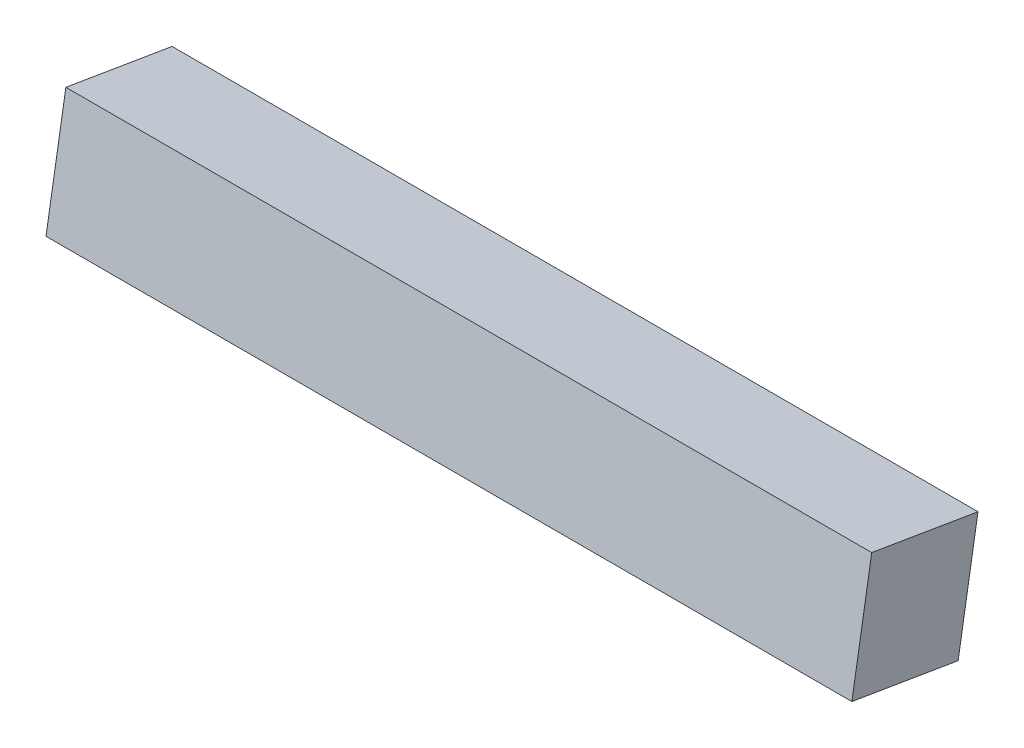
ISO-10303-21;
HEADER;
FILE_DESCRIPTION(('STEP AP214'),'2;1');
FILE_NAME('part.step','',(''),(''),'','','');
FILE_SCHEMA(('AUTOMOTIVE_DESIGN { 1 0 10303 214 1 1 1 1 }'));
ENDSEC;
DATA;
#1=APPLICATION_CONTEXT('core data for automotive mechanical design processes');
#2=APPLICATION_PROTOCOL_DEFINITION('international standard','automotive_design',2000,#1);
#3=PRODUCT_CONTEXT('',#1,'mechanical');
#4=PRODUCT('Part','Part','',(#3));
#5=PRODUCT_RELATED_PRODUCT_CATEGORY('part','',(#4));
#6=PRODUCT_DEFINITION_FORMATION('','',#4);
#7=PRODUCT_DEFINITION_CONTEXT('part definition',#1,'design');
#8=PRODUCT_DEFINITION('design','',#6,#7);
#9=PRODUCT_DEFINITION_SHAPE('','',#8);
#10=(LENGTH_UNIT() NAMED_UNIT(*) SI_UNIT(.MILLI.,.METRE.));
#11=(NAMED_UNIT(*) PLANE_ANGLE_UNIT() SI_UNIT($,.RADIAN.));
#12=(NAMED_UNIT(*) SI_UNIT($,.STERADIAN.) SOLID_ANGLE_UNIT());
#13=UNCERTAINTY_MEASURE_WITH_UNIT(LENGTH_MEASURE(1.E-05),#10,'distance_accuracy_value','');
#14=(GEOMETRIC_REPRESENTATION_CONTEXT(3) GLOBAL_UNCERTAINTY_ASSIGNED_CONTEXT((#13)) GLOBAL_UNIT_ASSIGNED_CONTEXT((#10,
#11,#12)) REPRESENTATION_CONTEXT('',''));
#15=CARTESIAN_POINT('',(0.,0.,0.));
#16=DIRECTION('',(0.,0.,1.));
#17=DIRECTION('',(1.,0.,0.));
#18=AXIS2_PLACEMENT_3D('',#15,#16,#17);
#19=CARTESIAN_POINT('',(1343.2192393736,1117.50372367477,1248.12409398602));
#20=DIRECTION('',(0.,0.986393923832144,-0.164398987305355));
#21=DIRECTION('',(0.,0.164398987305355,0.986393923832144));
#22=AXIS2_PLACEMENT_3D('',#19,#20,#21);
#23=PLANE('',#22);
#24=CARTESIAN_POINT('',(1343.2192393736,1116.68172873824,1243.19212436686));
#25=CARTESIAN_POINT('',(1355.68754660701,1116.68172873824,1243.19212436686));
#26=CARTESIAN_POINT('',(1368.15585384041,1116.68172873824,1243.19212436686));
#27=CARTESIAN_POINT('',(1380.62416107382,1116.68172873824,1243.19212436686));
#28=B_SPLINE_CURVE_WITH_KNOTS('',3,(#24,#25,#26,#27),.UNSPECIFIED.,.F.,.F.,(4,4),(0.,
0.434850380748231),.UNSPECIFIED.);
#29=CARTESIAN_POINT('',(1343.2192393736,1116.68172873824,1243.19212436686));
#30=VERTEX_POINT('',#29);
#31=CARTESIAN_POINT('',(1380.62416107382,1116.68172873824,1243.19212436686));
#32=VERTEX_POINT('',#31);
#33=EDGE_CURVE('E66',#30,#32,#28,.T.);
#34=ORIENTED_EDGE('',*,*,#33,.T.);
#35=DIRECTION('',(0.,-0.164398987305355,-0.986393923832144));
#36=VECTOR('',#35,1.);
#37=CARTESIAN_POINT('',(1380.62416107382,1117.50372367477,1248.12409398602));
#38=LINE('',#37,#36);
#39=CARTESIAN_POINT('',(1380.62416107382,1117.50372367477,1248.12409398602));
#40=VERTEX_POINT('',#39);
#41=EDGE_CURVE('E74',#40,#32,#38,.T.);
#42=ORIENTED_EDGE('',*,*,#41,.F.);
#43=CARTESIAN_POINT('',(1343.2192393736,1117.50372367477,1248.12409398602));
#44=CARTESIAN_POINT('',(1355.68754660701,1117.50372367477,1248.12409398602));
#45=CARTESIAN_POINT('',(1368.15585384041,1117.50372367477,1248.12409398602));
#46=CARTESIAN_POINT('',(1380.62416107382,1117.50372367477,1248.12409398602));
#47=B_SPLINE_CURVE_WITH_KNOTS('',3,(#43,#44,#45,#46),.UNSPECIFIED.,.F.,.F.,(4,4),(0.,
0.434850380748231),.UNSPECIFIED.);
#48=CARTESIAN_POINT('',(1343.2192393736,1117.50372367477,1248.12409398602));
#49=VERTEX_POINT('',#48);
#50=EDGE_CURVE('E79',#49,#40,#47,.T.);
#51=ORIENTED_EDGE('',*,*,#50,.F.);
#52=DIRECTION('',(0.,-0.164398987305355,-0.986393923832144));
#53=VECTOR('',#52,1.);
#54=CARTESIAN_POINT('',(1343.2192393736,1117.50372367477,1248.12409398602));
#55=LINE('',#54,#53);
#56=EDGE_CURVE('E71',#49,#30,#55,.T.);
#57=ORIENTED_EDGE('',*,*,#56,.T.);
#58=EDGE_LOOP('',(#34,#42,#51,#57));
#59=FACE_BOUND('',#58,.T.);
#60=ADVANCED_FACE('F17',(#59),#23,.F.);
#61=CARTESIAN_POINT('',(1380.62416107382,1117.50372367477,1248.12409398602));
#62=DIRECTION('',(-1.,0.,0.));
#63=DIRECTION('',(0.,0.,1.));
#64=AXIS2_PLACEMENT_3D('',#61,#62,#63);
#65=PLANE('',#64);
#66=CARTESIAN_POINT('',(1380.62416107382,1116.68172873824,1243.19212436686));
#67=CARTESIAN_POINT('',(1380.62416107382,1118.52432383384,1242.88502518426));
#68=CARTESIAN_POINT('',(1380.62416107382,1120.36691892945,1242.57792600166));
#69=CARTESIAN_POINT('',(1380.62416107382,1122.20951402505,1242.27082681906));
#70=B_SPLINE_CURVE_WITH_KNOTS('',3,(#66,#67,#68,#69),.UNSPECIFIED.,.F.,.F.,(4,4),
(0.434850380748231,0.5),.UNSPECIFIED.);
#71=CARTESIAN_POINT('',(1380.62416107382,1122.20951402505,1242.27082681906));
#72=VERTEX_POINT('',#71);
#73=EDGE_CURVE('E63',#32,#72,#70,.T.);
#74=ORIENTED_EDGE('',*,*,#73,.T.);
#75=DIRECTION('',(0.,-0.164398987305355,-0.986393923832144));
#76=VECTOR('',#75,1.);
#77=CARTESIAN_POINT('',(1380.62416107382,1123.03150896158,1247.20279643822));
#78=LINE('',#77,#76);
#79=CARTESIAN_POINT('',(1380.62416107382,1123.03150896158,1247.20279643822));
#80=VERTEX_POINT('',#79);
#81=EDGE_CURVE('E70',#80,#72,#78,.T.);
#82=ORIENTED_EDGE('',*,*,#81,.F.);
#83=CARTESIAN_POINT('',(1380.62416107382,1117.50372367477,1248.12409398602));
#84=CARTESIAN_POINT('',(1380.62416107382,1119.34631877037,1247.81699480342));
#85=CARTESIAN_POINT('',(1380.62416107382,1121.18891386597,1247.50989562082));
#86=CARTESIAN_POINT('',(1380.62416107382,1123.03150896158,1247.20279643822));
#87=B_SPLINE_CURVE_WITH_KNOTS('',3,(#83,#84,#85,#86),.UNSPECIFIED.,.F.,.F.,(4,4),
(0.434850380748231,0.5),.UNSPECIFIED.);
#88=EDGE_CURVE('E57',#40,#80,#87,.T.);
#89=ORIENTED_EDGE('',*,*,#88,.F.);
#90=ORIENTED_EDGE('',*,*,#41,.T.);
#91=EDGE_LOOP('',(#74,#82,#89,#90));
#92=FACE_BOUND('',#91,.T.);
#93=ADVANCED_FACE('F75',(#92),#65,.F.);
#94=CARTESIAN_POINT('',(1380.62416107382,1123.03150896158,1247.20279643822));
#95=DIRECTION('',(0.,-0.986393923832144,0.164398987305355));
#96=DIRECTION('',(0.,-0.164398987305355,-0.986393923832144));
#97=AXIS2_PLACEMENT_3D('',#94,#95,#96);
#98=PLANE('',#97);
#99=CARTESIAN_POINT('',(1380.62416107382,1122.20951402505,1242.27082681906));
#100=CARTESIAN_POINT('',(1368.15585384041,1122.20951402505,1242.27082681906));
#101=CARTESIAN_POINT('',(1355.68754660701,1122.20951402505,1242.27082681906));
#102=CARTESIAN_POINT('',(1343.2192393736,1122.20951402505,1242.27082681906));
#103=B_SPLINE_CURVE_WITH_KNOTS('',3,(#99,#100,#101,#102),.UNSPECIFIED.,.F.,.F.,(4,4),(0.5,
0.934850380748232),.UNSPECIFIED.);
#104=CARTESIAN_POINT('',(1343.2192393736,1122.20951402505,1242.27082681906));
#105=VERTEX_POINT('',#104);
#106=EDGE_CURVE('E67',#72,#105,#103,.T.);
#107=ORIENTED_EDGE('',*,*,#106,.T.);
#108=DIRECTION('',(0.,-0.164398987305355,-0.986393923832144));
#109=VECTOR('',#108,1.);
#110=CARTESIAN_POINT('',(1343.2192393736,1123.03150896158,1247.20279643822));
#111=LINE('',#110,#109);
#112=CARTESIAN_POINT('',(1343.2192393736,1123.03150896158,1247.20279643822));
#113=VERTEX_POINT('',#112);
#114=EDGE_CURVE('E126',#113,#105,#111,.T.);
#115=ORIENTED_EDGE('',*,*,#114,.F.);
#116=CARTESIAN_POINT('',(1380.62416107382,1123.03150896158,1247.20279643822));
#117=CARTESIAN_POINT('',(1368.15585384041,1123.03150896158,1247.20279643822));
#118=CARTESIAN_POINT('',(1355.68754660701,1123.03150896158,1247.20279643822));
#119=CARTESIAN_POINT('',(1343.2192393736,1123.03150896158,1247.20279643822));
#120=B_SPLINE_CURVE_WITH_KNOTS('',3,(#116,#117,#118,#119),.UNSPECIFIED.,.F.,.F.,(4,4),(0.5,
0.934850380748232),.UNSPECIFIED.);
#121=EDGE_CURVE('E38',#80,#113,#120,.T.);
#122=ORIENTED_EDGE('',*,*,#121,.F.);
#123=ORIENTED_EDGE('',*,*,#81,.T.);
#124=EDGE_LOOP('',(#107,#115,#122,#123));
#125=FACE_BOUND('',#124,.T.);
#126=ADVANCED_FACE('F160',(#125),#98,.F.);
#127=CARTESIAN_POINT('',(1343.2192393736,1123.03150896158,1247.20279643822));
#128=DIRECTION('',(1.,0.,0.));
#129=DIRECTION('',(0.,0.,-1.));
#130=AXIS2_PLACEMENT_3D('',#127,#128,#129);
#131=PLANE('',#130);
#132=CARTESIAN_POINT('',(1343.2192393736,1122.20951402505,1242.27082681906));
#133=CARTESIAN_POINT('',(1343.2192393736,1120.36691892945,1242.57792600166));
#134=CARTESIAN_POINT('',(1343.2192393736,1118.52432383384,1242.88502518426));
#135=CARTESIAN_POINT('',(1343.2192393736,1116.68172873824,1243.19212436686));
#136=B_SPLINE_CURVE_WITH_KNOTS('',3,(#132,#133,#134,#135),.UNSPECIFIED.,.F.,.F.,(4,4),
(0.934850380748232,1.),.UNSPECIFIED.);
#137=EDGE_CURVE('E30',#105,#30,#136,.T.);
#138=ORIENTED_EDGE('',*,*,#137,.T.);
#139=ORIENTED_EDGE('',*,*,#56,.F.);
#140=CARTESIAN_POINT('',(1343.2192393736,1123.03150896158,1247.20279643822));
#141=CARTESIAN_POINT('',(1343.2192393736,1121.18891386597,1247.50989562082));
#142=CARTESIAN_POINT('',(1343.2192393736,1119.34631877037,1247.81699480342));
#143=CARTESIAN_POINT('',(1343.2192393736,1117.50372367477,1248.12409398602));
#144=B_SPLINE_CURVE_WITH_KNOTS('',3,(#140,#141,#142,#143),.UNSPECIFIED.,.F.,.F.,(4,4),
(0.934850380748232,1.),.UNSPECIFIED.);
#145=EDGE_CURVE('E11',#113,#49,#144,.T.);
#146=ORIENTED_EDGE('',*,*,#145,.F.);
#147=ORIENTED_EDGE('',*,*,#114,.T.);
#148=EDGE_LOOP('',(#138,#139,#146,#147));
#149=FACE_BOUND('',#148,.T.);
#150=ADVANCED_FACE('F157',(#149),#131,.F.);
#151=CARTESIAN_POINT('',(1361.92170022371,1117.50372367477,1248.12409398602));
#152=DIRECTION('',(0.,-0.164398987305453,-0.986393923832128));
#153=DIRECTION('',(0.,0.986393923832128,-0.164398987305453));
#154=AXIS2_PLACEMENT_3D('',#151,#152,#153);
#155=PLANE('',#154);
#156=ORIENTED_EDGE('',*,*,#50,.T.);
#157=ORIENTED_EDGE('',*,*,#88,.T.);
#158=ORIENTED_EDGE('',*,*,#121,.T.);
#159=ORIENTED_EDGE('',*,*,#145,.T.);
#160=EDGE_LOOP('',(#156,#157,#158,#159));
#161=FACE_BOUND('',#160,.T.);
#162=ADVANCED_FACE('F169',(#161),#155,.F.);
#163=CARTESIAN_POINT('',(1361.92170022371,1116.68172873824,1243.19212436686));
#164=DIRECTION('',(0.,-0.164398987305453,-0.986393923832128));
#165=DIRECTION('',(0.,0.986393923832128,-0.164398987305453));
#166=AXIS2_PLACEMENT_3D('',#163,#164,#165);
#167=PLANE('',#166);
#168=ORIENTED_EDGE('',*,*,#33,.F.);
#169=ORIENTED_EDGE('',*,*,#137,.F.);
#170=ORIENTED_EDGE('',*,*,#106,.F.);
#171=ORIENTED_EDGE('',*,*,#73,.F.);
#172=EDGE_LOOP('',(#168,#169,#170,#171));
#173=FACE_BOUND('',#172,.T.);
#174=ADVANCED_FACE('F19',(#173),#167,.T.);
#175=CLOSED_SHELL('',(#60,#93,#126,#150,#162,#174));
#176=MANIFOLD_SOLID_BREP('B1',#175);
#177=ADVANCED_BREP_SHAPE_REPRESENTATION('',(#18,#176),#14);
#178=SHAPE_DEFINITION_REPRESENTATION(#9,#177);
ENDSEC;
END-ISO-10303-21;
